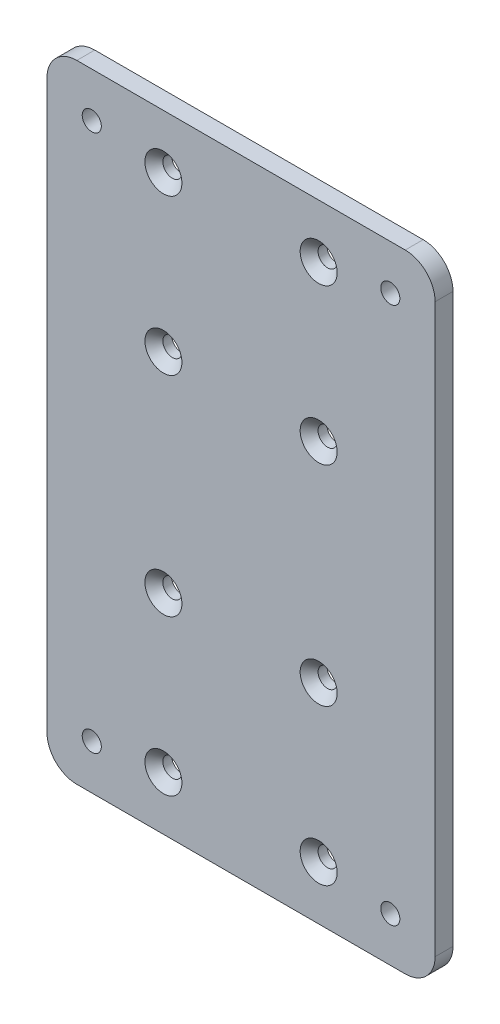
ISO-10303-21;
HEADER;
FILE_DESCRIPTION(('STEP AP214'),'2;1');
FILE_NAME('part.step','',(''),(''),'','','');
FILE_SCHEMA(('AUTOMOTIVE_DESIGN { 1 0 10303 214 1 1 1 1 }'));
ENDSEC;
DATA;
#1=APPLICATION_CONTEXT('core data for automotive mechanical design processes');
#2=APPLICATION_PROTOCOL_DEFINITION('international standard','automotive_design',2000,#1);
#3=PRODUCT_CONTEXT('',#1,'mechanical');
#4=PRODUCT('Part','Part','',(#3));
#5=PRODUCT_RELATED_PRODUCT_CATEGORY('part','',(#4));
#6=PRODUCT_DEFINITION_FORMATION('','',#4);
#7=PRODUCT_DEFINITION_CONTEXT('part definition',#1,'design');
#8=PRODUCT_DEFINITION('design','',#6,#7);
#9=PRODUCT_DEFINITION_SHAPE('','',#8);
#10=(LENGTH_UNIT() NAMED_UNIT(*) SI_UNIT(.MILLI.,.METRE.));
#11=(NAMED_UNIT(*) PLANE_ANGLE_UNIT() SI_UNIT($,.RADIAN.));
#12=(NAMED_UNIT(*) SI_UNIT($,.STERADIAN.) SOLID_ANGLE_UNIT());
#13=UNCERTAINTY_MEASURE_WITH_UNIT(LENGTH_MEASURE(1.E-05),#10,'distance_accuracy_value','');
#14=(GEOMETRIC_REPRESENTATION_CONTEXT(3) GLOBAL_UNCERTAINTY_ASSIGNED_CONTEXT((#13)) GLOBAL_UNIT_ASSIGNED_CONTEXT((#10,
#11,#12)) REPRESENTATION_CONTEXT('',''));
#15=CARTESIAN_POINT('',(0.,0.,0.));
#16=DIRECTION('',(0.,0.,1.));
#17=DIRECTION('',(1.,0.,0.));
#18=AXIS2_PLACEMENT_3D('',#15,#16,#17);
#19=CARTESIAN_POINT('',(0.,0.,3.));
#20=DIRECTION('',(0.,0.,-1.));
#21=DIRECTION('',(-1.,0.,0.));
#22=AXIS2_PLACEMENT_3D('',#19,#20,#21);
#23=PLANE('',#22);
#24=CARTESIAN_POINT('',(-13.0000000000001,-43.4999999999999,3.));
#25=DIRECTION('',(0.,0.,-1.));
#26=DIRECTION('',(-1.,0.,0.));
#27=AXIS2_PLACEMENT_3D('',#24,#25,#26);
#28=CIRCLE('',#27,3.10000000000001);
#29=CARTESIAN_POINT('',(-16.1000000000001,-43.4999999999999,3.));
#30=VERTEX_POINT('',#29);
#31=EDGE_CURVE('E197',#30,#30,#28,.T.);
#32=ORIENTED_EDGE('',*,*,#31,.T.);
#33=EDGE_LOOP('',(#32));
#34=FACE_BOUND('',#33,.T.);
#35=CARTESIAN_POINT('',(12.9999999999999,-43.5000000000001,3.));
#36=DIRECTION('',(0.,0.,-1.));
#37=DIRECTION('',(-1.,0.,0.));
#38=AXIS2_PLACEMENT_3D('',#35,#36,#37);
#39=CIRCLE('',#38,3.10000000000001);
#40=CARTESIAN_POINT('',(9.89999999999993,-43.5000000000001,3.));
#41=VERTEX_POINT('',#40);
#42=EDGE_CURVE('E194',#41,#41,#39,.T.);
#43=ORIENTED_EDGE('',*,*,#42,.T.);
#44=EDGE_LOOP('',(#43));
#45=FACE_BOUND('',#44,.T.);
#46=CARTESIAN_POINT('',(13.0000000000001,-17.5000000000001,3.));
#47=DIRECTION('',(0.,0.,-1.));
#48=DIRECTION('',(-1.,0.,0.));
#49=AXIS2_PLACEMENT_3D('',#46,#47,#48);
#50=CIRCLE('',#49,3.10000000000001);
#51=CARTESIAN_POINT('',(9.90000000000006,-17.5000000000001,3.));
#52=VERTEX_POINT('',#51);
#53=EDGE_CURVE('E191',#52,#52,#50,.T.);
#54=ORIENTED_EDGE('',*,*,#53,.T.);
#55=EDGE_LOOP('',(#54));
#56=FACE_BOUND('',#55,.T.);
#57=CARTESIAN_POINT('',(-12.9999999999999,-17.4999999999999,3.));
#58=DIRECTION('',(0.,0.,-1.));
#59=DIRECTION('',(-1.,0.,0.));
#60=AXIS2_PLACEMENT_3D('',#57,#58,#59);
#61=CIRCLE('',#60,3.1);
#62=CARTESIAN_POINT('',(-16.0999999999999,-17.4999999999999,3.));
#63=VERTEX_POINT('',#62);
#64=EDGE_CURVE('E188',#63,#63,#61,.T.);
#65=ORIENTED_EDGE('',*,*,#64,.T.);
#66=EDGE_LOOP('',(#65));
#67=FACE_BOUND('',#66,.T.);
#68=CARTESIAN_POINT('',(12.9999999999999,17.4999999999999,3.));
#69=DIRECTION('',(0.,0.,-1.));
#70=DIRECTION('',(-1.,0.,0.));
#71=AXIS2_PLACEMENT_3D('',#68,#69,#70);
#72=CIRCLE('',#71,3.1);
#73=CARTESIAN_POINT('',(9.89999999999993,17.4999999999999,3.));
#74=VERTEX_POINT('',#73);
#75=EDGE_CURVE('E185',#74,#74,#72,.T.);
#76=ORIENTED_EDGE('',*,*,#75,.T.);
#77=EDGE_LOOP('',(#76));
#78=FACE_BOUND('',#77,.T.);
#79=CARTESIAN_POINT('',(-13.0000000000001,17.5000000000001,3.));
#80=DIRECTION('',(0.,0.,-1.));
#81=DIRECTION('',(-1.,0.,0.));
#82=AXIS2_PLACEMENT_3D('',#79,#80,#81);
#83=CIRCLE('',#82,3.1);
#84=CARTESIAN_POINT('',(-16.1000000000001,17.5000000000001,3.));
#85=VERTEX_POINT('',#84);
#86=EDGE_CURVE('E182',#85,#85,#83,.T.);
#87=ORIENTED_EDGE('',*,*,#86,.T.);
#88=EDGE_LOOP('',(#87));
#89=FACE_BOUND('',#88,.T.);
#90=CARTESIAN_POINT('',(13.0000000000001,43.4999999999999,3.));
#91=DIRECTION('',(0.,0.,-1.));
#92=DIRECTION('',(-1.,0.,0.));
#93=AXIS2_PLACEMENT_3D('',#90,#91,#92);
#94=CIRCLE('',#93,3.10000000000001);
#95=CARTESIAN_POINT('',(9.90000000000007,43.4999999999999,3.));
#96=VERTEX_POINT('',#95);
#97=EDGE_CURVE('E179',#96,#96,#94,.T.);
#98=ORIENTED_EDGE('',*,*,#97,.T.);
#99=EDGE_LOOP('',(#98));
#100=FACE_BOUND('',#99,.T.);
#101=CARTESIAN_POINT('',(-12.9999999999999,43.5000000000001,3.));
#102=DIRECTION('',(0.,0.,-1.));
#103=DIRECTION('',(-1.,0.,0.));
#104=AXIS2_PLACEMENT_3D('',#101,#102,#103);
#105=CIRCLE('',#104,3.1);
#106=CARTESIAN_POINT('',(-16.0999999999999,43.5000000000001,3.));
#107=VERTEX_POINT('',#106);
#108=EDGE_CURVE('E176',#107,#107,#105,.T.);
#109=ORIENTED_EDGE('',*,*,#108,.T.);
#110=EDGE_LOOP('',(#109));
#111=FACE_BOUND('',#110,.T.);
#112=DIRECTION('',(0.,-1.,0.));
#113=VECTOR('',#112,1.);
#114=CARTESIAN_POINT('',(-32.5,-52.5,3.));
#115=LINE('',#114,#113);
#116=CARTESIAN_POINT('',(-32.5,47.5,3.));
#117=VERTEX_POINT('',#116);
#118=CARTESIAN_POINT('',(-32.5,-47.5,3.));
#119=VERTEX_POINT('',#118);
#120=EDGE_CURVE('E339',#117,#119,#115,.T.);
#121=ORIENTED_EDGE('',*,*,#120,.T.);
#122=CARTESIAN_POINT('',(-27.5,-47.5,3.));
#123=DIRECTION('',(0.,0.,-1.));
#124=DIRECTION('',(-1.,0.,0.));
#125=AXIS2_PLACEMENT_3D('',#122,#123,#124);
#126=CIRCLE('',#125,5.);
#127=CARTESIAN_POINT('',(-27.5,-52.5,3.));
#128=VERTEX_POINT('',#127);
#129=EDGE_CURVE('E162',#119,#128,#126,.F.);
#130=ORIENTED_EDGE('',*,*,#129,.T.);
#131=DIRECTION('',(1.,0.,0.));
#132=VECTOR('',#131,1.);
#133=CARTESIAN_POINT('',(-32.5,-52.5,3.));
#134=LINE('',#133,#132);
#135=CARTESIAN_POINT('',(27.5,-52.5,3.));
#136=VERTEX_POINT('',#135);
#137=EDGE_CURVE('E133',#128,#136,#134,.T.);
#138=ORIENTED_EDGE('',*,*,#137,.T.);
#139=CARTESIAN_POINT('',(27.5,-47.5,3.));
#140=DIRECTION('',(0.,0.,-1.));
#141=DIRECTION('',(-1.,0.,0.));
#142=AXIS2_PLACEMENT_3D('',#139,#140,#141);
#143=CIRCLE('',#142,5.);
#144=CARTESIAN_POINT('',(32.5,-47.5,3.));
#145=VERTEX_POINT('',#144);
#146=EDGE_CURVE('E160',#136,#145,#143,.F.);
#147=ORIENTED_EDGE('',*,*,#146,.T.);
#148=DIRECTION('',(0.,1.,0.));
#149=VECTOR('',#148,1.);
#150=CARTESIAN_POINT('',(32.5,-52.5,3.));
#151=LINE('',#150,#149);
#152=CARTESIAN_POINT('',(32.5,47.5,3.));
#153=VERTEX_POINT('',#152);
#154=EDGE_CURVE('E140',#145,#153,#151,.T.);
#155=ORIENTED_EDGE('',*,*,#154,.T.);
#156=CARTESIAN_POINT('',(27.5,47.5,3.));
#157=DIRECTION('',(0.,0.,-1.));
#158=DIRECTION('',(-1.,0.,0.));
#159=AXIS2_PLACEMENT_3D('',#156,#157,#158);
#160=CIRCLE('',#159,5.);
#161=CARTESIAN_POINT('',(27.5,52.5,3.));
#162=VERTEX_POINT('',#161);
#163=EDGE_CURVE('E68',#153,#162,#160,.F.);
#164=ORIENTED_EDGE('',*,*,#163,.T.);
#165=DIRECTION('',(-1.,0.,0.));
#166=VECTOR('',#165,1.);
#167=CARTESIAN_POINT('',(-32.5,52.5,3.));
#168=LINE('',#167,#166);
#169=CARTESIAN_POINT('',(-27.5,52.5,3.));
#170=VERTEX_POINT('',#169);
#171=EDGE_CURVE('E143',#162,#170,#168,.T.);
#172=ORIENTED_EDGE('',*,*,#171,.T.);
#173=CARTESIAN_POINT('',(-27.5,47.5,3.));
#174=DIRECTION('',(0.,0.,-1.));
#175=DIRECTION('',(-1.,0.,0.));
#176=AXIS2_PLACEMENT_3D('',#173,#174,#175);
#177=CIRCLE('',#176,5.);
#178=EDGE_CURVE('E158',#170,#117,#177,.F.);
#179=ORIENTED_EDGE('',*,*,#178,.T.);
#180=EDGE_LOOP('',(#121,#130,#138,#147,#155,#164,#172,#179));
#181=FACE_BOUND('',#180,.T.);
#182=CARTESIAN_POINT('',(-25.,45.,3.));
#183=DIRECTION('',(0.,0.,1.));
#184=DIRECTION('',(1.,0.,0.));
#185=AXIS2_PLACEMENT_3D('',#182,#183,#184);
#186=CIRCLE('',#185,1.6);
#187=CARTESIAN_POINT('',(-23.4,45.,3.));
#188=VERTEX_POINT('',#187);
#189=EDGE_CURVE('E355',#188,#188,#186,.T.);
#190=ORIENTED_EDGE('',*,*,#189,.F.);
#191=EDGE_LOOP('',(#190));
#192=FACE_BOUND('',#191,.T.);
#193=CARTESIAN_POINT('',(25.,45.,3.));
#194=DIRECTION('',(0.,0.,1.));
#195=DIRECTION('',(1.,0.,0.));
#196=AXIS2_PLACEMENT_3D('',#193,#194,#195);
#197=CIRCLE('',#196,1.6);
#198=CARTESIAN_POINT('',(26.6,45.,3.));
#199=VERTEX_POINT('',#198);
#200=EDGE_CURVE('E359',#199,#199,#197,.T.);
#201=ORIENTED_EDGE('',*,*,#200,.F.);
#202=EDGE_LOOP('',(#201));
#203=FACE_BOUND('',#202,.T.);
#204=CARTESIAN_POINT('',(25.,-45.,3.));
#205=DIRECTION('',(0.,0.,1.));
#206=DIRECTION('',(1.,0.,0.));
#207=AXIS2_PLACEMENT_3D('',#204,#205,#206);
#208=CIRCLE('',#207,1.6);
#209=CARTESIAN_POINT('',(26.6,-45.,3.));
#210=VERTEX_POINT('',#209);
#211=EDGE_CURVE('E363',#210,#210,#208,.T.);
#212=ORIENTED_EDGE('',*,*,#211,.F.);
#213=EDGE_LOOP('',(#212));
#214=FACE_BOUND('',#213,.T.);
#215=CARTESIAN_POINT('',(-25.,-45.,3.));
#216=DIRECTION('',(0.,0.,1.));
#217=DIRECTION('',(1.,0.,0.));
#218=AXIS2_PLACEMENT_3D('',#215,#216,#217);
#219=CIRCLE('',#218,1.6);
#220=CARTESIAN_POINT('',(-23.4,-45.,3.));
#221=VERTEX_POINT('',#220);
#222=EDGE_CURVE('E366',#221,#221,#219,.T.);
#223=ORIENTED_EDGE('',*,*,#222,.F.);
#224=EDGE_LOOP('',(#223));
#225=FACE_BOUND('',#224,.T.);
#226=ADVANCED_FACE('F45',(#34,#45,#56,#67,#78,#89,#100,#111,#181,#192,#203,#214,#225),#23,.F.);
#227=CARTESIAN_POINT('',(0.,0.,0.));
#228=DIRECTION('',(0.,0.,-1.));
#229=DIRECTION('',(-1.,0.,0.));
#230=AXIS2_PLACEMENT_3D('',#227,#228,#229);
#231=PLANE('',#230);
#232=CARTESIAN_POINT('',(25.,-45.,0.));
#233=DIRECTION('',(0.,0.,1.));
#234=DIRECTION('',(1.,0.,0.));
#235=AXIS2_PLACEMENT_3D('',#232,#233,#234);
#236=CIRCLE('',#235,1.6);
#237=CARTESIAN_POINT('',(26.6,-45.,0.));
#238=VERTEX_POINT('',#237);
#239=EDGE_CURVE('E368',#238,#238,#236,.T.);
#240=ORIENTED_EDGE('',*,*,#239,.T.);
#241=EDGE_LOOP('',(#240));
#242=FACE_BOUND('',#241,.T.);
#243=CARTESIAN_POINT('',(-25.,45.,0.));
#244=DIRECTION('',(0.,0.,1.));
#245=DIRECTION('',(1.,0.,0.));
#246=AXIS2_PLACEMENT_3D('',#243,#244,#245);
#247=CIRCLE('',#246,1.6);
#248=CARTESIAN_POINT('',(-23.4,45.,0.));
#249=VERTEX_POINT('',#248);
#250=EDGE_CURVE('E379',#249,#249,#247,.T.);
#251=ORIENTED_EDGE('',*,*,#250,.T.);
#252=EDGE_LOOP('',(#251));
#253=FACE_BOUND('',#252,.T.);
#254=CARTESIAN_POINT('',(-13.0000000000001,-43.4999999999999,0.));
#255=DIRECTION('',(0.,0.,1.));
#256=DIRECTION('',(1.,0.,0.));
#257=AXIS2_PLACEMENT_3D('',#254,#255,#256);
#258=CIRCLE('',#257,1.6);
#259=CARTESIAN_POINT('',(-11.4000000000001,-43.4999999999999,0.));
#260=VERTEX_POINT('',#259);
#261=EDGE_CURVE('E388',#260,#260,#258,.T.);
#262=ORIENTED_EDGE('',*,*,#261,.T.);
#263=EDGE_LOOP('',(#262));
#264=FACE_BOUND('',#263,.T.);
#265=CARTESIAN_POINT('',(-12.9999999999999,-17.4999999999999,0.));
#266=DIRECTION('',(0.,0.,1.));
#267=DIRECTION('',(1.,0.,0.));
#268=AXIS2_PLACEMENT_3D('',#265,#266,#267);
#269=CIRCLE('',#268,1.6);
#270=CARTESIAN_POINT('',(-11.3999999999999,-17.4999999999999,0.));
#271=VERTEX_POINT('',#270);
#272=EDGE_CURVE('E394',#271,#271,#269,.T.);
#273=ORIENTED_EDGE('',*,*,#272,.T.);
#274=EDGE_LOOP('',(#273));
#275=FACE_BOUND('',#274,.T.);
#276=CARTESIAN_POINT('',(13.0000000000001,43.4999999999999,0.));
#277=DIRECTION('',(0.,0.,1.));
#278=DIRECTION('',(1.,0.,0.));
#279=AXIS2_PLACEMENT_3D('',#276,#277,#278);
#280=CIRCLE('',#279,1.6);
#281=CARTESIAN_POINT('',(14.6000000000001,43.4999999999999,0.));
#282=VERTEX_POINT('',#281);
#283=EDGE_CURVE('E334',#282,#282,#280,.T.);
#284=ORIENTED_EDGE('',*,*,#283,.T.);
#285=EDGE_LOOP('',(#284));
#286=FACE_BOUND('',#285,.T.);
#287=CARTESIAN_POINT('',(12.9999999999999,17.4999999999999,0.));
#288=DIRECTION('',(0.,0.,1.));
#289=DIRECTION('',(1.,0.,0.));
#290=AXIS2_PLACEMENT_3D('',#287,#288,#289);
#291=CIRCLE('',#290,1.6);
#292=CARTESIAN_POINT('',(14.5999999999999,17.4999999999999,0.));
#293=VERTEX_POINT('',#292);
#294=EDGE_CURVE('E326',#293,#293,#291,.T.);
#295=ORIENTED_EDGE('',*,*,#294,.T.);
#296=EDGE_LOOP('',(#295));
#297=FACE_BOUND('',#296,.T.);
#298=DIRECTION('',(1.,0.,0.));
#299=VECTOR('',#298,1.);
#300=CARTESIAN_POINT('',(-32.5,-52.5,0.));
#301=LINE('',#300,#299);
#302=CARTESIAN_POINT('',(-27.5,-52.5,0.));
#303=VERTEX_POINT('',#302);
#304=CARTESIAN_POINT('',(27.5,-52.5,0.));
#305=VERTEX_POINT('',#304);
#306=EDGE_CURVE('E130',#303,#305,#301,.T.);
#307=ORIENTED_EDGE('',*,*,#306,.F.);
#308=CARTESIAN_POINT('',(-27.5,-47.5,0.));
#309=DIRECTION('',(0.,0.,-1.));
#310=DIRECTION('',(-1.,0.,0.));
#311=AXIS2_PLACEMENT_3D('',#308,#309,#310);
#312=CIRCLE('',#311,5.);
#313=CARTESIAN_POINT('',(-32.5,-47.5,0.));
#314=VERTEX_POINT('',#313);
#315=EDGE_CURVE('E113',#303,#314,#312,.T.);
#316=ORIENTED_EDGE('',*,*,#315,.T.);
#317=DIRECTION('',(0.,-1.,0.));
#318=VECTOR('',#317,1.);
#319=CARTESIAN_POINT('',(-32.5,-52.5,0.));
#320=LINE('',#319,#318);
#321=CARTESIAN_POINT('',(-32.5,47.5,0.));
#322=VERTEX_POINT('',#321);
#323=EDGE_CURVE('E141',#322,#314,#320,.T.);
#324=ORIENTED_EDGE('',*,*,#323,.F.);
#325=CARTESIAN_POINT('',(-27.5,47.5,0.));
#326=DIRECTION('',(0.,0.,-1.));
#327=DIRECTION('',(-1.,0.,0.));
#328=AXIS2_PLACEMENT_3D('',#325,#326,#327);
#329=CIRCLE('',#328,5.);
#330=CARTESIAN_POINT('',(-27.5,52.5,0.));
#331=VERTEX_POINT('',#330);
#332=EDGE_CURVE('E151',#322,#331,#329,.T.);
#333=ORIENTED_EDGE('',*,*,#332,.T.);
#334=DIRECTION('',(-1.,0.,0.));
#335=VECTOR('',#334,1.);
#336=CARTESIAN_POINT('',(-32.5,52.5,0.));
#337=LINE('',#336,#335);
#338=CARTESIAN_POINT('',(27.5,52.5,0.));
#339=VERTEX_POINT('',#338);
#340=EDGE_CURVE('E145',#339,#331,#337,.T.);
#341=ORIENTED_EDGE('',*,*,#340,.F.);
#342=CARTESIAN_POINT('',(27.5,47.5,0.));
#343=DIRECTION('',(0.,0.,-1.));
#344=DIRECTION('',(-1.,0.,0.));
#345=AXIS2_PLACEMENT_3D('',#342,#343,#344);
#346=CIRCLE('',#345,5.);
#347=CARTESIAN_POINT('',(32.5,47.5,0.));
#348=VERTEX_POINT('',#347);
#349=EDGE_CURVE('E134',#339,#348,#346,.T.);
#350=ORIENTED_EDGE('',*,*,#349,.T.);
#351=DIRECTION('',(0.,1.,0.));
#352=VECTOR('',#351,1.);
#353=CARTESIAN_POINT('',(32.5,-52.5,0.));
#354=LINE('',#353,#352);
#355=CARTESIAN_POINT('',(32.5,-47.5,0.));
#356=VERTEX_POINT('',#355);
#357=EDGE_CURVE('E328',#356,#348,#354,.T.);
#358=ORIENTED_EDGE('',*,*,#357,.F.);
#359=CARTESIAN_POINT('',(27.5,-47.5,0.));
#360=DIRECTION('',(0.,0.,-1.));
#361=DIRECTION('',(-1.,0.,0.));
#362=AXIS2_PLACEMENT_3D('',#359,#360,#361);
#363=CIRCLE('',#362,5.);
#364=EDGE_CURVE('E124',#356,#305,#363,.T.);
#365=ORIENTED_EDGE('',*,*,#364,.T.);
#366=EDGE_LOOP('',(#307,#316,#324,#333,#341,#350,#358,#365));
#367=FACE_BOUND('',#366,.T.);
#368=CARTESIAN_POINT('',(-12.9999999999999,43.5000000000001,0.));
#369=DIRECTION('',(0.,0.,1.));
#370=DIRECTION('',(1.,0.,0.));
#371=AXIS2_PLACEMENT_3D('',#368,#369,#370);
#372=CIRCLE('',#371,1.6);
#373=CARTESIAN_POINT('',(-11.3999999999999,43.5000000000001,0.));
#374=VERTEX_POINT('',#373);
#375=EDGE_CURVE('E329',#374,#374,#372,.T.);
#376=ORIENTED_EDGE('',*,*,#375,.T.);
#377=EDGE_LOOP('',(#376));
#378=FACE_BOUND('',#377,.T.);
#379=CARTESIAN_POINT('',(-13.0000000000001,17.5000000000001,0.));
#380=DIRECTION('',(0.,0.,1.));
#381=DIRECTION('',(1.,0.,0.));
#382=AXIS2_PLACEMENT_3D('',#379,#380,#381);
#383=CIRCLE('',#382,1.6);
#384=CARTESIAN_POINT('',(-11.4000000000001,17.5000000000001,0.));
#385=VERTEX_POINT('',#384);
#386=EDGE_CURVE('E397',#385,#385,#383,.T.);
#387=ORIENTED_EDGE('',*,*,#386,.T.);
#388=EDGE_LOOP('',(#387));
#389=FACE_BOUND('',#388,.T.);
#390=CARTESIAN_POINT('',(13.0000000000001,-17.5000000000001,0.));
#391=DIRECTION('',(0.,0.,1.));
#392=DIRECTION('',(1.,0.,0.));
#393=AXIS2_PLACEMENT_3D('',#390,#391,#392);
#394=CIRCLE('',#393,1.6);
#395=CARTESIAN_POINT('',(14.6000000000001,-17.5000000000001,0.));
#396=VERTEX_POINT('',#395);
#397=EDGE_CURVE('E391',#396,#396,#394,.T.);
#398=ORIENTED_EDGE('',*,*,#397,.T.);
#399=EDGE_LOOP('',(#398));
#400=FACE_BOUND('',#399,.T.);
#401=CARTESIAN_POINT('',(12.9999999999999,-43.5000000000001,0.));
#402=DIRECTION('',(0.,0.,1.));
#403=DIRECTION('',(1.,0.,0.));
#404=AXIS2_PLACEMENT_3D('',#401,#402,#403);
#405=CIRCLE('',#404,1.6);
#406=CARTESIAN_POINT('',(14.5999999999999,-43.5000000000001,0.));
#407=VERTEX_POINT('',#406);
#408=EDGE_CURVE('E383',#407,#407,#405,.T.);
#409=ORIENTED_EDGE('',*,*,#408,.T.);
#410=EDGE_LOOP('',(#409));
#411=FACE_BOUND('',#410,.T.);
#412=CARTESIAN_POINT('',(25.,45.,0.));
#413=DIRECTION('',(0.,0.,1.));
#414=DIRECTION('',(1.,0.,0.));
#415=AXIS2_PLACEMENT_3D('',#412,#413,#414);
#416=CIRCLE('',#415,1.6);
#417=CARTESIAN_POINT('',(26.6,45.,0.));
#418=VERTEX_POINT('',#417);
#419=EDGE_CURVE('E376',#418,#418,#416,.T.);
#420=ORIENTED_EDGE('',*,*,#419,.T.);
#421=EDGE_LOOP('',(#420));
#422=FACE_BOUND('',#421,.T.);
#423=CARTESIAN_POINT('',(-25.,-45.,0.));
#424=DIRECTION('',(0.,0.,1.));
#425=DIRECTION('',(1.,0.,0.));
#426=AXIS2_PLACEMENT_3D('',#423,#424,#425);
#427=CIRCLE('',#426,1.6);
#428=CARTESIAN_POINT('',(-23.4,-45.,0.));
#429=VERTEX_POINT('',#428);
#430=EDGE_CURVE('E369',#429,#429,#427,.T.);
#431=ORIENTED_EDGE('',*,*,#430,.T.);
#432=EDGE_LOOP('',(#431));
#433=FACE_BOUND('',#432,.T.);
#434=ADVANCED_FACE('F137',(#242,#253,#264,#275,#286,#297,#367,#378,#389,#400,#411,#422,#433),
#231,.T.);
#435=CARTESIAN_POINT('',(32.5,-52.5,3.));
#436=DIRECTION('',(-1.,0.,0.));
#437=DIRECTION('',(0.,-1.,0.));
#438=AXIS2_PLACEMENT_3D('',#435,#436,#437);
#439=PLANE('',#438);
#440=ORIENTED_EDGE('',*,*,#154,.F.);
#441=DIRECTION('',(0.,0.,-1.));
#442=VECTOR('',#441,1.);
#443=CARTESIAN_POINT('',(32.5,-47.5,3.));
#444=LINE('',#443,#442);
#445=EDGE_CURVE('E166',#145,#356,#444,.T.);
#446=ORIENTED_EDGE('',*,*,#445,.T.);
#447=ORIENTED_EDGE('',*,*,#357,.T.);
#448=DIRECTION('',(0.,0.,-1.));
#449=VECTOR('',#448,1.);
#450=CARTESIAN_POINT('',(32.5,47.5,3.));
#451=LINE('',#450,#449);
#452=EDGE_CURVE('E164',#348,#153,#451,.F.);
#453=ORIENTED_EDGE('',*,*,#452,.T.);
#454=EDGE_LOOP('',(#440,#446,#447,#453));
#455=FACE_BOUND('',#454,.T.);
#456=ADVANCED_FACE('F242',(#455),#439,.F.);
#457=CARTESIAN_POINT('',(-32.5,52.5,3.));
#458=DIRECTION('',(0.,-1.,0.));
#459=DIRECTION('',(0.,0.,-1.));
#460=AXIS2_PLACEMENT_3D('',#457,#458,#459);
#461=PLANE('',#460);
#462=ORIENTED_EDGE('',*,*,#340,.T.);
#463=DIRECTION('',(0.,0.,-1.));
#464=VECTOR('',#463,1.);
#465=CARTESIAN_POINT('',(-27.5,52.5,3.));
#466=LINE('',#465,#464);
#467=EDGE_CURVE('E61',#331,#170,#466,.F.);
#468=ORIENTED_EDGE('',*,*,#467,.T.);
#469=ORIENTED_EDGE('',*,*,#171,.F.);
#470=DIRECTION('',(0.,0.,-1.));
#471=VECTOR('',#470,1.);
#472=CARTESIAN_POINT('',(27.5,52.5,3.));
#473=LINE('',#472,#471);
#474=EDGE_CURVE('E169',#162,#339,#473,.T.);
#475=ORIENTED_EDGE('',*,*,#474,.T.);
#476=EDGE_LOOP('',(#462,#468,#469,#475));
#477=FACE_BOUND('',#476,.T.);
#478=ADVANCED_FACE('F255',(#477),#461,.F.);
#479=CARTESIAN_POINT('',(-32.5,-52.5,3.));
#480=DIRECTION('',(1.,0.,0.));
#481=DIRECTION('',(0.,1.,0.));
#482=AXIS2_PLACEMENT_3D('',#479,#480,#481);
#483=PLANE('',#482);
#484=ORIENTED_EDGE('',*,*,#323,.T.);
#485=DIRECTION('',(0.,0.,-1.));
#486=VECTOR('',#485,1.);
#487=CARTESIAN_POINT('',(-32.5,-47.5,3.));
#488=LINE('',#487,#486);
#489=EDGE_CURVE('E118',#314,#119,#488,.F.);
#490=ORIENTED_EDGE('',*,*,#489,.T.);
#491=ORIENTED_EDGE('',*,*,#120,.F.);
#492=DIRECTION('',(0.,0.,-1.));
#493=VECTOR('',#492,1.);
#494=CARTESIAN_POINT('',(-32.5,47.5,3.));
#495=LINE('',#494,#493);
#496=EDGE_CURVE('E123',#117,#322,#495,.T.);
#497=ORIENTED_EDGE('',*,*,#496,.T.);
#498=EDGE_LOOP('',(#484,#490,#491,#497));
#499=FACE_BOUND('',#498,.T.);
#500=ADVANCED_FACE('F252',(#499),#483,.F.);
#501=CARTESIAN_POINT('',(-32.5,-52.5,3.));
#502=DIRECTION('',(0.,1.,0.));
#503=DIRECTION('',(0.,0.,1.));
#504=AXIS2_PLACEMENT_3D('',#501,#502,#503);
#505=PLANE('',#504);
#506=ORIENTED_EDGE('',*,*,#137,.F.);
#507=DIRECTION('',(0.,0.,-1.));
#508=VECTOR('',#507,1.);
#509=CARTESIAN_POINT('',(-27.5,-52.5,3.));
#510=LINE('',#509,#508);
#511=EDGE_CURVE('E117',#128,#303,#510,.T.);
#512=ORIENTED_EDGE('',*,*,#511,.T.);
#513=ORIENTED_EDGE('',*,*,#306,.T.);
#514=DIRECTION('',(0.,0.,-1.));
#515=VECTOR('',#514,1.);
#516=CARTESIAN_POINT('',(27.5,-52.5,3.));
#517=LINE('',#516,#515);
#518=EDGE_CURVE('E135',#305,#136,#517,.F.);
#519=ORIENTED_EDGE('',*,*,#518,.T.);
#520=EDGE_LOOP('',(#506,#512,#513,#519));
#521=FACE_BOUND('',#520,.T.);
#522=ADVANCED_FACE('F129',(#521),#505,.F.);
#523=CARTESIAN_POINT('',(12.9999999999999,17.4999999999999,3.));
#524=DIRECTION('',(0.,0.,-1.));
#525=DIRECTION('',(-1.,0.,0.));
#526=AXIS2_PLACEMENT_3D('',#523,#524,#525);
#527=CYLINDRICAL_SURFACE('',#526,1.6);
#528=CARTESIAN_POINT('',(12.9999999999999,17.4999999999999,1.5));
#529=DIRECTION('',(0.,0.,-1.));
#530=DIRECTION('',(-1.,0.,0.));
#531=AXIS2_PLACEMENT_3D('',#528,#529,#530);
#532=CIRCLE('',#531,1.6);
#533=CARTESIAN_POINT('',(11.3999999999999,17.4999999999999,1.5));
#534=VERTEX_POINT('',#533);
#535=EDGE_CURVE('E209',#534,#534,#532,.F.);
#536=ORIENTED_EDGE('',*,*,#535,.T.);
#537=EDGE_LOOP('',(#536));
#538=FACE_BOUND('',#537,.T.);
#539=ORIENTED_EDGE('',*,*,#294,.F.);
#540=EDGE_LOOP('',(#539));
#541=FACE_BOUND('',#540,.T.);
#542=ADVANCED_FACE('F247',(#538,#541),#527,.F.);
#543=CARTESIAN_POINT('',(-12.9999999999999,43.5000000000001,3.));
#544=DIRECTION('',(0.,0.,-1.));
#545=DIRECTION('',(-1.,0.,0.));
#546=AXIS2_PLACEMENT_3D('',#543,#544,#545);
#547=CYLINDRICAL_SURFACE('',#546,1.6);
#548=CARTESIAN_POINT('',(-12.9999999999999,43.5000000000001,1.5));
#549=DIRECTION('',(0.,0.,-1.));
#550=DIRECTION('',(-1.,0.,0.));
#551=AXIS2_PLACEMENT_3D('',#548,#549,#550);
#552=CIRCLE('',#551,1.6);
#553=CARTESIAN_POINT('',(-14.5999999999999,43.5000000000001,1.5));
#554=VERTEX_POINT('',#553);
#555=EDGE_CURVE('E11',#554,#554,#552,.F.);
#556=ORIENTED_EDGE('',*,*,#555,.T.);
#557=EDGE_LOOP('',(#556));
#558=FACE_BOUND('',#557,.T.);
#559=ORIENTED_EDGE('',*,*,#375,.F.);
#560=EDGE_LOOP('',(#559));
#561=FACE_BOUND('',#560,.T.);
#562=ADVANCED_FACE('F323',(#558,#561),#547,.F.);
#563=CARTESIAN_POINT('',(13.0000000000001,43.4999999999999,3.));
#564=DIRECTION('',(0.,0.,-1.));
#565=DIRECTION('',(-1.,0.,0.));
#566=AXIS2_PLACEMENT_3D('',#563,#564,#565);
#567=CYLINDRICAL_SURFACE('',#566,1.6);
#568=CARTESIAN_POINT('',(13.0000000000001,43.4999999999999,1.5));
#569=DIRECTION('',(0.,0.,-1.));
#570=DIRECTION('',(-1.,0.,0.));
#571=AXIS2_PLACEMENT_3D('',#568,#569,#570);
#572=CIRCLE('',#571,1.6);
#573=CARTESIAN_POINT('',(11.4000000000001,43.4999999999999,1.5));
#574=VERTEX_POINT('',#573);
#575=EDGE_CURVE('E54',#574,#574,#572,.F.);
#576=ORIENTED_EDGE('',*,*,#575,.T.);
#577=EDGE_LOOP('',(#576));
#578=FACE_BOUND('',#577,.T.);
#579=ORIENTED_EDGE('',*,*,#283,.F.);
#580=EDGE_LOOP('',(#579));
#581=FACE_BOUND('',#580,.T.);
#582=ADVANCED_FACE('F217',(#578,#581),#567,.F.);
#583=CARTESIAN_POINT('',(-13.0000000000001,17.5000000000001,3.));
#584=DIRECTION('',(0.,0.,-1.));
#585=DIRECTION('',(-1.,0.,0.));
#586=AXIS2_PLACEMENT_3D('',#583,#584,#585);
#587=CYLINDRICAL_SURFACE('',#586,1.6);
#588=CARTESIAN_POINT('',(-13.0000000000001,17.5000000000001,1.5));
#589=DIRECTION('',(0.,0.,-1.));
#590=DIRECTION('',(-1.,0.,0.));
#591=AXIS2_PLACEMENT_3D('',#588,#589,#590);
#592=CIRCLE('',#591,1.6);
#593=CARTESIAN_POINT('',(-14.6000000000001,17.5000000000001,1.5));
#594=VERTEX_POINT('',#593);
#595=EDGE_CURVE('E212',#594,#594,#592,.F.);
#596=ORIENTED_EDGE('',*,*,#595,.T.);
#597=EDGE_LOOP('',(#596));
#598=FACE_BOUND('',#597,.T.);
#599=ORIENTED_EDGE('',*,*,#386,.F.);
#600=EDGE_LOOP('',(#599));
#601=FACE_BOUND('',#600,.T.);
#602=ADVANCED_FACE('F403',(#598,#601),#587,.F.);
#603=CARTESIAN_POINT('',(-12.9999999999999,-17.4999999999999,3.));
#604=DIRECTION('',(0.,0.,-1.));
#605=DIRECTION('',(-1.,0.,0.));
#606=AXIS2_PLACEMENT_3D('',#603,#604,#605);
#607=CYLINDRICAL_SURFACE('',#606,1.6);
#608=CARTESIAN_POINT('',(-12.9999999999999,-17.4999999999999,1.5));
#609=DIRECTION('',(0.,0.,-1.));
#610=DIRECTION('',(-1.,0.,0.));
#611=AXIS2_PLACEMENT_3D('',#608,#609,#610);
#612=CIRCLE('',#611,1.6);
#613=CARTESIAN_POINT('',(-14.5999999999999,-17.4999999999999,1.5));
#614=VERTEX_POINT('',#613);
#615=EDGE_CURVE('E206',#614,#614,#612,.F.);
#616=ORIENTED_EDGE('',*,*,#615,.T.);
#617=EDGE_LOOP('',(#616));
#618=FACE_BOUND('',#617,.T.);
#619=ORIENTED_EDGE('',*,*,#272,.F.);
#620=EDGE_LOOP('',(#619));
#621=FACE_BOUND('',#620,.T.);
#622=ADVANCED_FACE('F409',(#618,#621),#607,.F.);
#623=CARTESIAN_POINT('',(13.0000000000001,-17.5000000000001,3.));
#624=DIRECTION('',(0.,0.,-1.));
#625=DIRECTION('',(-1.,0.,0.));
#626=AXIS2_PLACEMENT_3D('',#623,#624,#625);
#627=CYLINDRICAL_SURFACE('',#626,1.6);
#628=CARTESIAN_POINT('',(13.0000000000001,-17.5000000000001,1.5));
#629=DIRECTION('',(0.,0.,-1.));
#630=DIRECTION('',(-1.,0.,0.));
#631=AXIS2_PLACEMENT_3D('',#628,#629,#630);
#632=CIRCLE('',#631,1.6);
#633=CARTESIAN_POINT('',(11.4000000000001,-17.5000000000001,1.5));
#634=VERTEX_POINT('',#633);
#635=EDGE_CURVE('E203',#634,#634,#632,.F.);
#636=ORIENTED_EDGE('',*,*,#635,.T.);
#637=EDGE_LOOP('',(#636));
#638=FACE_BOUND('',#637,.T.);
#639=ORIENTED_EDGE('',*,*,#397,.F.);
#640=EDGE_LOOP('',(#639));
#641=FACE_BOUND('',#640,.T.);
#642=ADVANCED_FACE('F416',(#638,#641),#627,.F.);
#643=CARTESIAN_POINT('',(-13.0000000000001,-43.4999999999999,3.));
#644=DIRECTION('',(0.,0.,-1.));
#645=DIRECTION('',(-1.,0.,0.));
#646=AXIS2_PLACEMENT_3D('',#643,#644,#645);
#647=CYLINDRICAL_SURFACE('',#646,1.6);
#648=CARTESIAN_POINT('',(-13.0000000000001,-43.4999999999999,1.5));
#649=DIRECTION('',(0.,0.,-1.));
#650=DIRECTION('',(-1.,0.,0.));
#651=AXIS2_PLACEMENT_3D('',#648,#649,#650);
#652=CIRCLE('',#651,1.6);
#653=CARTESIAN_POINT('',(-14.6000000000001,-43.4999999999999,1.5));
#654=VERTEX_POINT('',#653);
#655=EDGE_CURVE('E173',#654,#654,#652,.F.);
#656=ORIENTED_EDGE('',*,*,#655,.T.);
#657=EDGE_LOOP('',(#656));
#658=FACE_BOUND('',#657,.T.);
#659=ORIENTED_EDGE('',*,*,#261,.F.);
#660=EDGE_LOOP('',(#659));
#661=FACE_BOUND('',#660,.T.);
#662=ADVANCED_FACE('F420',(#658,#661),#647,.F.);
#663=CARTESIAN_POINT('',(12.9999999999999,-43.5000000000001,3.));
#664=DIRECTION('',(0.,0.,-1.));
#665=DIRECTION('',(-1.,0.,0.));
#666=AXIS2_PLACEMENT_3D('',#663,#664,#665);
#667=CYLINDRICAL_SURFACE('',#666,1.6);
#668=CARTESIAN_POINT('',(12.9999999999999,-43.5000000000001,1.5));
#669=DIRECTION('',(0.,0.,-1.));
#670=DIRECTION('',(-1.,0.,0.));
#671=AXIS2_PLACEMENT_3D('',#668,#669,#670);
#672=CIRCLE('',#671,1.6);
#673=CARTESIAN_POINT('',(11.3999999999999,-43.5000000000001,1.5));
#674=VERTEX_POINT('',#673);
#675=EDGE_CURVE('E200',#674,#674,#672,.F.);
#676=ORIENTED_EDGE('',*,*,#675,.T.);
#677=EDGE_LOOP('',(#676));
#678=FACE_BOUND('',#677,.T.);
#679=ORIENTED_EDGE('',*,*,#408,.F.);
#680=EDGE_LOOP('',(#679));
#681=FACE_BOUND('',#680,.T.);
#682=ADVANCED_FACE('F424',(#678,#681),#667,.F.);
#683=CARTESIAN_POINT('',(-25.,45.,3.));
#684=DIRECTION('',(0.,0.,-1.));
#685=DIRECTION('',(-1.,0.,0.));
#686=AXIS2_PLACEMENT_3D('',#683,#684,#685);
#687=CYLINDRICAL_SURFACE('',#686,1.6);
#688=ORIENTED_EDGE('',*,*,#189,.T.);
#689=EDGE_LOOP('',(#688));
#690=FACE_BOUND('',#689,.T.);
#691=ORIENTED_EDGE('',*,*,#250,.F.);
#692=EDGE_LOOP('',(#691));
#693=FACE_BOUND('',#692,.T.);
#694=ADVANCED_FACE('F428',(#690,#693),#687,.F.);
#695=CARTESIAN_POINT('',(25.,45.,3.));
#696=DIRECTION('',(0.,0.,-1.));
#697=DIRECTION('',(-1.,0.,0.));
#698=AXIS2_PLACEMENT_3D('',#695,#696,#697);
#699=CYLINDRICAL_SURFACE('',#698,1.6);
#700=ORIENTED_EDGE('',*,*,#200,.T.);
#701=EDGE_LOOP('',(#700));
#702=FACE_BOUND('',#701,.T.);
#703=ORIENTED_EDGE('',*,*,#419,.F.);
#704=EDGE_LOOP('',(#703));
#705=FACE_BOUND('',#704,.T.);
#706=ADVANCED_FACE('F432',(#702,#705),#699,.F.);
#707=CARTESIAN_POINT('',(25.,-45.,3.));
#708=DIRECTION('',(0.,0.,-1.));
#709=DIRECTION('',(-1.,0.,0.));
#710=AXIS2_PLACEMENT_3D('',#707,#708,#709);
#711=CYLINDRICAL_SURFACE('',#710,1.6);
#712=ORIENTED_EDGE('',*,*,#211,.T.);
#713=EDGE_LOOP('',(#712));
#714=FACE_BOUND('',#713,.T.);
#715=ORIENTED_EDGE('',*,*,#239,.F.);
#716=EDGE_LOOP('',(#715));
#717=FACE_BOUND('',#716,.T.);
#718=ADVANCED_FACE('F436',(#714,#717),#711,.F.);
#719=CARTESIAN_POINT('',(-25.,-45.,3.));
#720=DIRECTION('',(0.,0.,-1.));
#721=DIRECTION('',(-1.,0.,0.));
#722=AXIS2_PLACEMENT_3D('',#719,#720,#721);
#723=CYLINDRICAL_SURFACE('',#722,1.6);
#724=ORIENTED_EDGE('',*,*,#222,.T.);
#725=EDGE_LOOP('',(#724));
#726=FACE_BOUND('',#725,.T.);
#727=ORIENTED_EDGE('',*,*,#430,.F.);
#728=EDGE_LOOP('',(#727));
#729=FACE_BOUND('',#728,.T.);
#730=ADVANCED_FACE('F265',(#726,#729),#723,.F.);
#731=CARTESIAN_POINT('',(-27.5,-47.5,3.));
#732=DIRECTION('',(0.,0.,-1.));
#733=DIRECTION('',(-1.,0.,0.));
#734=AXIS2_PLACEMENT_3D('',#731,#732,#733);
#735=CYLINDRICAL_SURFACE('',#734,5.);
#736=ORIENTED_EDGE('',*,*,#129,.F.);
#737=ORIENTED_EDGE('',*,*,#489,.F.);
#738=ORIENTED_EDGE('',*,*,#315,.F.);
#739=ORIENTED_EDGE('',*,*,#511,.F.);
#740=EDGE_LOOP('',(#736,#737,#738,#739));
#741=FACE_BOUND('',#740,.T.);
#742=ADVANCED_FACE('F116',(#741),#735,.T.);
#743=CARTESIAN_POINT('',(27.5,-47.5,3.));
#744=DIRECTION('',(0.,0.,-1.));
#745=DIRECTION('',(-1.,0.,0.));
#746=AXIS2_PLACEMENT_3D('',#743,#744,#745);
#747=CYLINDRICAL_SURFACE('',#746,5.);
#748=ORIENTED_EDGE('',*,*,#146,.F.);
#749=ORIENTED_EDGE('',*,*,#518,.F.);
#750=ORIENTED_EDGE('',*,*,#364,.F.);
#751=ORIENTED_EDGE('',*,*,#445,.F.);
#752=EDGE_LOOP('',(#748,#749,#750,#751));
#753=FACE_BOUND('',#752,.T.);
#754=ADVANCED_FACE('F264',(#753),#747,.T.);
#755=CARTESIAN_POINT('',(-27.5,47.5,3.));
#756=DIRECTION('',(0.,0.,-1.));
#757=DIRECTION('',(-1.,0.,0.));
#758=AXIS2_PLACEMENT_3D('',#755,#756,#757);
#759=CYLINDRICAL_SURFACE('',#758,5.);
#760=ORIENTED_EDGE('',*,*,#178,.F.);
#761=ORIENTED_EDGE('',*,*,#467,.F.);
#762=ORIENTED_EDGE('',*,*,#332,.F.);
#763=ORIENTED_EDGE('',*,*,#496,.F.);
#764=EDGE_LOOP('',(#760,#761,#762,#763));
#765=FACE_BOUND('',#764,.T.);
#766=ADVANCED_FACE('F268',(#765),#759,.T.);
#767=CARTESIAN_POINT('',(27.5,47.5,3.));
#768=DIRECTION('',(0.,0.,-1.));
#769=DIRECTION('',(-1.,0.,0.));
#770=AXIS2_PLACEMENT_3D('',#767,#768,#769);
#771=CYLINDRICAL_SURFACE('',#770,5.);
#772=ORIENTED_EDGE('',*,*,#163,.F.);
#773=ORIENTED_EDGE('',*,*,#452,.F.);
#774=ORIENTED_EDGE('',*,*,#349,.F.);
#775=ORIENTED_EDGE('',*,*,#474,.F.);
#776=EDGE_LOOP('',(#772,#773,#774,#775));
#777=FACE_BOUND('',#776,.T.);
#778=ADVANCED_FACE('F272',(#777),#771,.T.);
#779=CARTESIAN_POINT('',(-13.0000000000001,-43.4999999999999,1.5));
#780=DIRECTION('',(0.,0.,1.));
#781=DIRECTION('',(1.,0.,0.));
#782=AXIS2_PLACEMENT_3D('',#779,#780,#781);
#783=CONICAL_SURFACE('',#782,1.6,0.785398163397451);
#784=ORIENTED_EDGE('',*,*,#31,.F.);
#785=EDGE_LOOP('',(#784));
#786=FACE_BOUND('',#785,.T.);
#787=ORIENTED_EDGE('',*,*,#655,.F.);
#788=EDGE_LOOP('',(#787));
#789=FACE_BOUND('',#788,.T.);
#790=ADVANCED_FACE('F275',(#786,#789),#783,.F.);
#791=CARTESIAN_POINT('',(12.9999999999999,-43.5000000000001,1.5));
#792=DIRECTION('',(0.,0.,1.));
#793=DIRECTION('',(1.,0.,0.));
#794=AXIS2_PLACEMENT_3D('',#791,#792,#793);
#795=CONICAL_SURFACE('',#794,1.6,0.785398163397451);
#796=ORIENTED_EDGE('',*,*,#42,.F.);
#797=EDGE_LOOP('',(#796));
#798=FACE_BOUND('',#797,.T.);
#799=ORIENTED_EDGE('',*,*,#675,.F.);
#800=EDGE_LOOP('',(#799));
#801=FACE_BOUND('',#800,.T.);
#802=ADVANCED_FACE('F283',(#798,#801),#795,.F.);
#803=CARTESIAN_POINT('',(13.0000000000001,-17.5000000000001,1.5));
#804=DIRECTION('',(0.,0.,1.));
#805=DIRECTION('',(1.,0.,0.));
#806=AXIS2_PLACEMENT_3D('',#803,#804,#805);
#807=CONICAL_SURFACE('',#806,1.6,0.785398163397451);
#808=ORIENTED_EDGE('',*,*,#53,.F.);
#809=EDGE_LOOP('',(#808));
#810=FACE_BOUND('',#809,.T.);
#811=ORIENTED_EDGE('',*,*,#635,.F.);
#812=EDGE_LOOP('',(#811));
#813=FACE_BOUND('',#812,.T.);
#814=ADVANCED_FACE('F290',(#810,#813),#807,.F.);
#815=CARTESIAN_POINT('',(-12.9999999999999,-17.4999999999999,1.5));
#816=DIRECTION('',(0.,0.,1.));
#817=DIRECTION('',(1.,0.,0.));
#818=AXIS2_PLACEMENT_3D('',#815,#816,#817);
#819=CONICAL_SURFACE('',#818,1.6,0.78539816339745);
#820=ORIENTED_EDGE('',*,*,#64,.F.);
#821=EDGE_LOOP('',(#820));
#822=FACE_BOUND('',#821,.T.);
#823=ORIENTED_EDGE('',*,*,#615,.F.);
#824=EDGE_LOOP('',(#823));
#825=FACE_BOUND('',#824,.T.);
#826=ADVANCED_FACE('F297',(#822,#825),#819,.F.);
#827=CARTESIAN_POINT('',(12.9999999999999,17.4999999999999,1.5));
#828=DIRECTION('',(0.,0.,1.));
#829=DIRECTION('',(1.,0.,0.));
#830=AXIS2_PLACEMENT_3D('',#827,#828,#829);
#831=CONICAL_SURFACE('',#830,1.6,0.78539816339745);
#832=ORIENTED_EDGE('',*,*,#75,.F.);
#833=EDGE_LOOP('',(#832));
#834=FACE_BOUND('',#833,.T.);
#835=ORIENTED_EDGE('',*,*,#535,.F.);
#836=EDGE_LOOP('',(#835));
#837=FACE_BOUND('',#836,.T.);
#838=ADVANCED_FACE('F229',(#834,#837),#831,.F.);
#839=CARTESIAN_POINT('',(-13.0000000000001,17.5000000000001,1.5));
#840=DIRECTION('',(0.,0.,1.));
#841=DIRECTION('',(1.,0.,0.));
#842=AXIS2_PLACEMENT_3D('',#839,#840,#841);
#843=CONICAL_SURFACE('',#842,1.6,0.78539816339745);
#844=ORIENTED_EDGE('',*,*,#86,.F.);
#845=EDGE_LOOP('',(#844));
#846=FACE_BOUND('',#845,.T.);
#847=ORIENTED_EDGE('',*,*,#595,.F.);
#848=EDGE_LOOP('',(#847));
#849=FACE_BOUND('',#848,.T.);
#850=ADVANCED_FACE('F222',(#846,#849),#843,.F.);
#851=CARTESIAN_POINT('',(13.0000000000001,43.4999999999999,1.5));
#852=DIRECTION('',(0.,0.,1.));
#853=DIRECTION('',(1.,0.,0.));
#854=AXIS2_PLACEMENT_3D('',#851,#852,#853);
#855=CONICAL_SURFACE('',#854,1.6,0.785398163397451);
#856=ORIENTED_EDGE('',*,*,#97,.F.);
#857=EDGE_LOOP('',(#856));
#858=FACE_BOUND('',#857,.T.);
#859=ORIENTED_EDGE('',*,*,#575,.F.);
#860=EDGE_LOOP('',(#859));
#861=FACE_BOUND('',#860,.T.);
#862=ADVANCED_FACE('F220',(#858,#861),#855,.F.);
#863=CARTESIAN_POINT('',(-12.9999999999999,43.5000000000001,1.5));
#864=DIRECTION('',(0.,0.,1.));
#865=DIRECTION('',(1.,0.,0.));
#866=AXIS2_PLACEMENT_3D('',#863,#864,#865);
#867=CONICAL_SURFACE('',#866,1.6,0.785398163397451);
#868=ORIENTED_EDGE('',*,*,#108,.F.);
#869=EDGE_LOOP('',(#868));
#870=FACE_BOUND('',#869,.T.);
#871=ORIENTED_EDGE('',*,*,#555,.F.);
#872=EDGE_LOOP('',(#871));
#873=FACE_BOUND('',#872,.T.);
#874=ADVANCED_FACE('F48',(#870,#873),#867,.F.);
#875=CLOSED_SHELL('',(#226,#434,#456,#478,#500,#522,#542,#562,#582,#602,#622,#642,#662,#682,
#694,#706,#718,#730,#742,#754,#766,#778,#790,#802,#814,#826,#838,#850,#862,#874));
#876=MANIFOLD_SOLID_BREP('B2',#875);
#877=ADVANCED_BREP_SHAPE_REPRESENTATION('',(#18,#876),#14);
#878=SHAPE_DEFINITION_REPRESENTATION(#9,#877);
ENDSEC;
END-ISO-10303-21;
